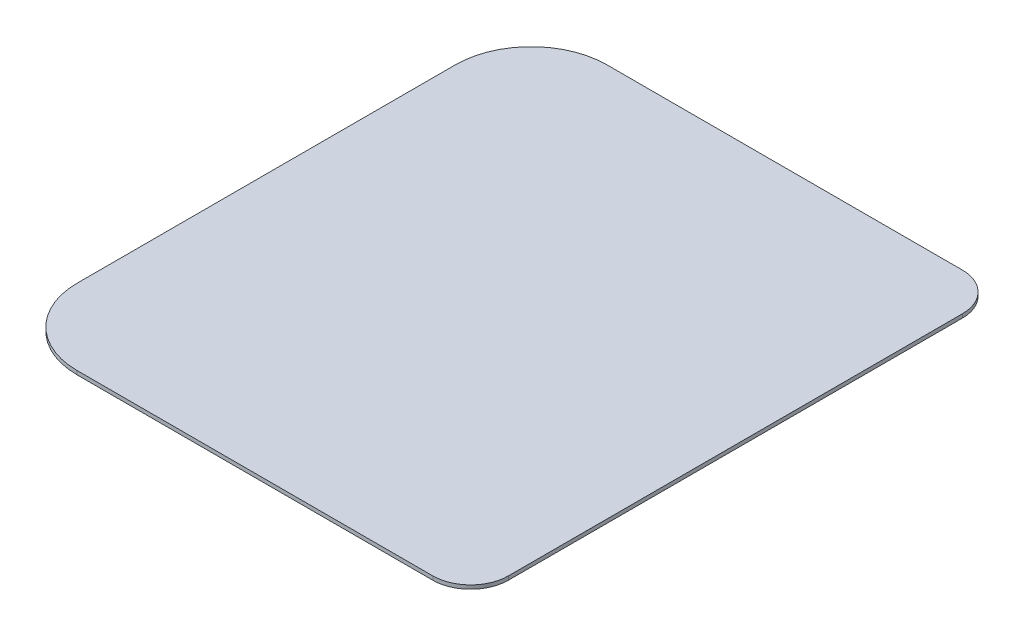
ISO-10303-21;
HEADER;
FILE_DESCRIPTION(('STEP AP214'),'2;1');
FILE_NAME('part.step','',(''),(''),'','','');
FILE_SCHEMA(('AUTOMOTIVE_DESIGN { 1 0 10303 214 1 1 1 1 }'));
ENDSEC;
DATA;
#1=APPLICATION_CONTEXT('core data for automotive mechanical design processes');
#2=APPLICATION_PROTOCOL_DEFINITION('international standard','automotive_design',2000,#1);
#3=PRODUCT_CONTEXT('',#1,'mechanical');
#4=PRODUCT('Part','Part','',(#3));
#5=PRODUCT_RELATED_PRODUCT_CATEGORY('part','',(#4));
#6=PRODUCT_DEFINITION_FORMATION('','',#4);
#7=PRODUCT_DEFINITION_CONTEXT('part definition',#1,'design');
#8=PRODUCT_DEFINITION('design','',#6,#7);
#9=PRODUCT_DEFINITION_SHAPE('','',#8);
#10=(LENGTH_UNIT() NAMED_UNIT(*) SI_UNIT(.MILLI.,.METRE.));
#11=(NAMED_UNIT(*) PLANE_ANGLE_UNIT() SI_UNIT($,.RADIAN.));
#12=(NAMED_UNIT(*) SI_UNIT($,.STERADIAN.) SOLID_ANGLE_UNIT());
#13=UNCERTAINTY_MEASURE_WITH_UNIT(LENGTH_MEASURE(1.E-05),#10,'distance_accuracy_value','');
#14=(GEOMETRIC_REPRESENTATION_CONTEXT(3) GLOBAL_UNCERTAINTY_ASSIGNED_CONTEXT((#13)) GLOBAL_UNIT_ASSIGNED_CONTEXT((#10,
#11,#12)) REPRESENTATION_CONTEXT('',''));
#15=CARTESIAN_POINT('',(0.,0.,0.));
#16=DIRECTION('',(0.,0.,1.));
#17=DIRECTION('',(1.,0.,0.));
#18=AXIS2_PLACEMENT_3D('',#15,#16,#17);
#19=CARTESIAN_POINT('',(-210.,5.,250.));
#20=DIRECTION('',(0.,-1.,0.));
#21=DIRECTION('',(0.,0.,-1.));
#22=AXIS2_PLACEMENT_3D('',#19,#20,#21);
#23=CYLINDRICAL_SURFACE('',#22,100.);
#24=CARTESIAN_POINT('',(-210.,0.,250.));
#25=DIRECTION('',(0.,1.,0.));
#26=DIRECTION('',(0.,0.,-1.));
#27=AXIS2_PLACEMENT_3D('',#24,#25,#26);
#28=CIRCLE('',#27,100.);
#29=CARTESIAN_POINT('',(-310.,0.,250.));
#30=VERTEX_POINT('',#29);
#31=CARTESIAN_POINT('',(-210.,0.,350.));
#32=VERTEX_POINT('',#31);
#33=EDGE_CURVE('E208',#30,#32,#28,.T.);
#34=ORIENTED_EDGE('',*,*,#33,.T.);
#35=DIRECTION('',(0.,-1.,0.));
#36=VECTOR('',#35,1.);
#37=CARTESIAN_POINT('',(-210.,5.,350.));
#38=LINE('',#37,#36);
#39=CARTESIAN_POINT('',(-210.,5.,350.));
#40=VERTEX_POINT('',#39);
#41=EDGE_CURVE('E12',#40,#32,#38,.T.);
#42=ORIENTED_EDGE('',*,*,#41,.F.);
#43=CARTESIAN_POINT('',(-210.,5.,250.));
#44=DIRECTION('',(0.,1.,0.));
#45=DIRECTION('',(0.,0.,-1.));
#46=AXIS2_PLACEMENT_3D('',#43,#44,#45);
#47=CIRCLE('',#46,100.);
#48=CARTESIAN_POINT('',(-310.,5.,250.));
#49=VERTEX_POINT('',#48);
#50=EDGE_CURVE('E162',#49,#40,#47,.T.);
#51=ORIENTED_EDGE('',*,*,#50,.F.);
#52=DIRECTION('',(0.,-1.,0.));
#53=VECTOR('',#52,1.);
#54=CARTESIAN_POINT('',(-310.,5.,250.));
#55=LINE('',#54,#53);
#56=EDGE_CURVE('E137',#49,#30,#55,.T.);
#57=ORIENTED_EDGE('',*,*,#56,.T.);
#58=EDGE_LOOP('',(#34,#42,#51,#57));
#59=FACE_BOUND('',#58,.T.);
#60=ADVANCED_FACE('F40',(#59),#23,.T.);
#61=CARTESIAN_POINT('',(-210.,5.,350.));
#62=DIRECTION('',(0.,0.,-1.));
#63=DIRECTION('',(-1.,0.,0.));
#64=AXIS2_PLACEMENT_3D('',#61,#62,#63);
#65=PLANE('',#64);
#66=DIRECTION('',(1.,0.,0.));
#67=VECTOR('',#66,1.);
#68=CARTESIAN_POINT('',(-210.,0.,350.));
#69=LINE('',#68,#67);
#70=CARTESIAN_POINT('',(260.,0.,350.));
#71=VERTEX_POINT('',#70);
#72=EDGE_CURVE('E199',#32,#71,#69,.T.);
#73=ORIENTED_EDGE('',*,*,#72,.T.);
#74=DIRECTION('',(0.,-1.,0.));
#75=VECTOR('',#74,1.);
#76=CARTESIAN_POINT('',(260.,5.,350.));
#77=LINE('',#76,#75);
#78=CARTESIAN_POINT('',(260.,5.,350.));
#79=VERTEX_POINT('',#78);
#80=EDGE_CURVE('E49',#79,#71,#77,.T.);
#81=ORIENTED_EDGE('',*,*,#80,.F.);
#82=DIRECTION('',(1.,0.,0.));
#83=VECTOR('',#82,1.);
#84=CARTESIAN_POINT('',(-210.,5.,350.));
#85=LINE('',#84,#83);
#86=EDGE_CURVE('E100',#40,#79,#85,.T.);
#87=ORIENTED_EDGE('',*,*,#86,.F.);
#88=ORIENTED_EDGE('',*,*,#41,.T.);
#89=EDGE_LOOP('',(#73,#81,#87,#88));
#90=FACE_BOUND('',#89,.T.);
#91=ADVANCED_FACE('F230',(#90),#65,.F.);
#92=CARTESIAN_POINT('',(260.,5.,300.));
#93=DIRECTION('',(0.,-1.,0.));
#94=DIRECTION('',(0.,0.,-1.));
#95=AXIS2_PLACEMENT_3D('',#92,#93,#94);
#96=CYLINDRICAL_SURFACE('',#95,50.);
#97=CARTESIAN_POINT('',(260.,0.,300.));
#98=DIRECTION('',(0.,1.,0.));
#99=DIRECTION('',(0.,0.,-1.));
#100=AXIS2_PLACEMENT_3D('',#97,#98,#99);
#101=CIRCLE('',#100,50.);
#102=CARTESIAN_POINT('',(310.,0.,300.));
#103=VERTEX_POINT('',#102);
#104=EDGE_CURVE('E194',#71,#103,#101,.T.);
#105=ORIENTED_EDGE('',*,*,#104,.T.);
#106=DIRECTION('',(0.,-1.,0.));
#107=VECTOR('',#106,1.);
#108=CARTESIAN_POINT('',(310.,5.,300.));
#109=LINE('',#108,#107);
#110=CARTESIAN_POINT('',(310.,5.,300.));
#111=VERTEX_POINT('',#110);
#112=EDGE_CURVE('E184',#111,#103,#109,.T.);
#113=ORIENTED_EDGE('',*,*,#112,.F.);
#114=CARTESIAN_POINT('',(260.,5.,300.));
#115=DIRECTION('',(0.,1.,0.));
#116=DIRECTION('',(0.,0.,-1.));
#117=AXIS2_PLACEMENT_3D('',#114,#115,#116);
#118=CIRCLE('',#117,50.);
#119=EDGE_CURVE('E154',#79,#111,#118,.T.);
#120=ORIENTED_EDGE('',*,*,#119,.F.);
#121=ORIENTED_EDGE('',*,*,#80,.T.);
#122=EDGE_LOOP('',(#105,#113,#120,#121));
#123=FACE_BOUND('',#122,.T.);
#124=ADVANCED_FACE('F192',(#123),#96,.T.);
#125=CARTESIAN_POINT('',(310.,5.,300.));
#126=DIRECTION('',(-1.,0.,0.));
#127=DIRECTION('',(0.,0.,1.));
#128=AXIS2_PLACEMENT_3D('',#125,#126,#127);
#129=PLANE('',#128);
#130=DIRECTION('',(0.,0.,-1.));
#131=VECTOR('',#130,1.);
#132=CARTESIAN_POINT('',(310.,0.,300.));
#133=LINE('',#132,#131);
#134=CARTESIAN_POINT('',(310.,0.,-300.));
#135=VERTEX_POINT('',#134);
#136=EDGE_CURVE('E201',#103,#135,#133,.T.);
#137=ORIENTED_EDGE('',*,*,#136,.T.);
#138=DIRECTION('',(0.,-1.,0.));
#139=VECTOR('',#138,1.);
#140=CARTESIAN_POINT('',(310.,5.,-300.));
#141=LINE('',#140,#139);
#142=CARTESIAN_POINT('',(310.,5.,-300.));
#143=VERTEX_POINT('',#142);
#144=EDGE_CURVE('E180',#143,#135,#141,.T.);
#145=ORIENTED_EDGE('',*,*,#144,.F.);
#146=DIRECTION('',(0.,0.,-1.));
#147=VECTOR('',#146,1.);
#148=CARTESIAN_POINT('',(310.,5.,300.));
#149=LINE('',#148,#147);
#150=EDGE_CURVE('E150',#111,#143,#149,.T.);
#151=ORIENTED_EDGE('',*,*,#150,.F.);
#152=ORIENTED_EDGE('',*,*,#112,.T.);
#153=EDGE_LOOP('',(#137,#145,#151,#152));
#154=FACE_BOUND('',#153,.T.);
#155=ADVANCED_FACE('F237',(#154),#129,.F.);
#156=CARTESIAN_POINT('',(260.,5.,-300.));
#157=DIRECTION('',(0.,-1.,0.));
#158=DIRECTION('',(0.,0.,-1.));
#159=AXIS2_PLACEMENT_3D('',#156,#157,#158);
#160=CYLINDRICAL_SURFACE('',#159,50.);
#161=CARTESIAN_POINT('',(260.,0.,-300.));
#162=DIRECTION('',(0.,1.,0.));
#163=DIRECTION('',(0.,0.,1.));
#164=AXIS2_PLACEMENT_3D('',#161,#162,#163);
#165=CIRCLE('',#164,50.);
#166=CARTESIAN_POINT('',(260.,0.,-350.));
#167=VERTEX_POINT('',#166);
#168=EDGE_CURVE('E206',#135,#167,#165,.T.);
#169=ORIENTED_EDGE('',*,*,#168,.T.);
#170=DIRECTION('',(0.,-1.,0.));
#171=VECTOR('',#170,1.);
#172=CARTESIAN_POINT('',(260.,5.,-350.));
#173=LINE('',#172,#171);
#174=CARTESIAN_POINT('',(260.,5.,-350.));
#175=VERTEX_POINT('',#174);
#176=EDGE_CURVE('E130',#175,#167,#173,.T.);
#177=ORIENTED_EDGE('',*,*,#176,.F.);
#178=CARTESIAN_POINT('',(260.,5.,-300.));
#179=DIRECTION('',(0.,1.,0.));
#180=DIRECTION('',(0.,0.,1.));
#181=AXIS2_PLACEMENT_3D('',#178,#179,#180);
#182=CIRCLE('',#181,50.);
#183=EDGE_CURVE('E119',#143,#175,#182,.T.);
#184=ORIENTED_EDGE('',*,*,#183,.F.);
#185=ORIENTED_EDGE('',*,*,#144,.T.);
#186=EDGE_LOOP('',(#169,#177,#184,#185));
#187=FACE_BOUND('',#186,.T.);
#188=ADVANCED_FACE('F214',(#187),#160,.T.);
#189=CARTESIAN_POINT('',(-210.,5.,-350.));
#190=DIRECTION('',(0.,0.,1.));
#191=DIRECTION('',(1.,0.,0.));
#192=AXIS2_PLACEMENT_3D('',#189,#190,#191);
#193=PLANE('',#192);
#194=DIRECTION('',(-1.,0.,0.));
#195=VECTOR('',#194,1.);
#196=CARTESIAN_POINT('',(-210.,0.,-350.));
#197=LINE('',#196,#195);
#198=CARTESIAN_POINT('',(-210.,0.,-350.));
#199=VERTEX_POINT('',#198);
#200=EDGE_CURVE('E128',#167,#199,#197,.T.);
#201=ORIENTED_EDGE('',*,*,#200,.T.);
#202=DIRECTION('',(0.,-1.,0.));
#203=VECTOR('',#202,1.);
#204=CARTESIAN_POINT('',(-210.,5.,-350.));
#205=LINE('',#204,#203);
#206=CARTESIAN_POINT('',(-210.,5.,-350.));
#207=VERTEX_POINT('',#206);
#208=EDGE_CURVE('E125',#207,#199,#205,.T.);
#209=ORIENTED_EDGE('',*,*,#208,.F.);
#210=DIRECTION('',(-1.,0.,0.));
#211=VECTOR('',#210,1.);
#212=CARTESIAN_POINT('',(-210.,5.,-350.));
#213=LINE('',#212,#211);
#214=EDGE_CURVE('E113',#175,#207,#213,.T.);
#215=ORIENTED_EDGE('',*,*,#214,.F.);
#216=ORIENTED_EDGE('',*,*,#176,.T.);
#217=EDGE_LOOP('',(#201,#209,#215,#216));
#218=FACE_BOUND('',#217,.T.);
#219=ADVANCED_FACE('F126',(#218),#193,.F.);
#220=CARTESIAN_POINT('',(-210.,5.,-250.));
#221=DIRECTION('',(0.,-1.,0.));
#222=DIRECTION('',(0.,0.,-1.));
#223=AXIS2_PLACEMENT_3D('',#220,#221,#222);
#224=CYLINDRICAL_SURFACE('',#223,100.);
#225=CARTESIAN_POINT('',(-210.,0.,-250.));
#226=DIRECTION('',(0.,1.,0.));
#227=DIRECTION('',(0.,0.,-1.));
#228=AXIS2_PLACEMENT_3D('',#225,#226,#227);
#229=CIRCLE('',#228,100.);
#230=CARTESIAN_POINT('',(-310.,0.,-250.));
#231=VERTEX_POINT('',#230);
#232=EDGE_CURVE('E86',#199,#231,#229,.T.);
#233=ORIENTED_EDGE('',*,*,#232,.T.);
#234=DIRECTION('',(0.,-1.,0.));
#235=VECTOR('',#234,1.);
#236=CARTESIAN_POINT('',(-310.,5.,-250.));
#237=LINE('',#236,#235);
#238=CARTESIAN_POINT('',(-310.,5.,-250.));
#239=VERTEX_POINT('',#238);
#240=EDGE_CURVE('E131',#239,#231,#237,.T.);
#241=ORIENTED_EDGE('',*,*,#240,.F.);
#242=CARTESIAN_POINT('',(-210.,5.,-250.));
#243=DIRECTION('',(0.,1.,0.));
#244=DIRECTION('',(0.,0.,-1.));
#245=AXIS2_PLACEMENT_3D('',#242,#243,#244);
#246=CIRCLE('',#245,100.);
#247=EDGE_CURVE('E117',#207,#239,#246,.T.);
#248=ORIENTED_EDGE('',*,*,#247,.F.);
#249=ORIENTED_EDGE('',*,*,#208,.T.);
#250=EDGE_LOOP('',(#233,#241,#248,#249));
#251=FACE_BOUND('',#250,.T.);
#252=ADVANCED_FACE('F133',(#251),#224,.T.);
#253=CARTESIAN_POINT('',(-310.,5.,250.));
#254=DIRECTION('',(1.,0.,0.));
#255=DIRECTION('',(0.,0.,-1.));
#256=AXIS2_PLACEMENT_3D('',#253,#254,#255);
#257=PLANE('',#256);
#258=DIRECTION('',(0.,0.,1.));
#259=VECTOR('',#258,1.);
#260=CARTESIAN_POINT('',(-310.,0.,250.));
#261=LINE('',#260,#259);
#262=EDGE_CURVE('E92',#231,#30,#261,.T.);
#263=ORIENTED_EDGE('',*,*,#262,.T.);
#264=ORIENTED_EDGE('',*,*,#56,.F.);
#265=DIRECTION('',(0.,0.,1.));
#266=VECTOR('',#265,1.);
#267=CARTESIAN_POINT('',(-310.,5.,250.));
#268=LINE('',#267,#266);
#269=EDGE_CURVE('E57',#239,#49,#268,.T.);
#270=ORIENTED_EDGE('',*,*,#269,.F.);
#271=ORIENTED_EDGE('',*,*,#240,.T.);
#272=EDGE_LOOP('',(#263,#264,#270,#271));
#273=FACE_BOUND('',#272,.T.);
#274=ADVANCED_FACE('F219',(#273),#257,.F.);
#275=CARTESIAN_POINT('',(-210.,5.,250.));
#276=DIRECTION('',(0.,-1.,0.));
#277=DIRECTION('',(0.,0.,-1.));
#278=AXIS2_PLACEMENT_3D('',#275,#276,#277);
#279=PLANE('',#278);
#280=ORIENTED_EDGE('',*,*,#50,.T.);
#281=ORIENTED_EDGE('',*,*,#86,.T.);
#282=ORIENTED_EDGE('',*,*,#119,.T.);
#283=ORIENTED_EDGE('',*,*,#150,.T.);
#284=ORIENTED_EDGE('',*,*,#183,.T.);
#285=ORIENTED_EDGE('',*,*,#214,.T.);
#286=ORIENTED_EDGE('',*,*,#247,.T.);
#287=ORIENTED_EDGE('',*,*,#269,.T.);
#288=EDGE_LOOP('',(#280,#281,#282,#283,#284,#285,#286,#287));
#289=FACE_BOUND('',#288,.T.);
#290=ADVANCED_FACE('F115',(#289),#279,.F.);
#291=CARTESIAN_POINT('',(-210.,0.,250.));
#292=DIRECTION('',(0.,-1.,0.));
#293=DIRECTION('',(0.,0.,-1.));
#294=AXIS2_PLACEMENT_3D('',#291,#292,#293);
#295=PLANE('',#294);
#296=ORIENTED_EDGE('',*,*,#33,.F.);
#297=ORIENTED_EDGE('',*,*,#262,.F.);
#298=ORIENTED_EDGE('',*,*,#232,.F.);
#299=ORIENTED_EDGE('',*,*,#200,.F.);
#300=ORIENTED_EDGE('',*,*,#168,.F.);
#301=ORIENTED_EDGE('',*,*,#136,.F.);
#302=ORIENTED_EDGE('',*,*,#104,.F.);
#303=ORIENTED_EDGE('',*,*,#72,.F.);
#304=EDGE_LOOP('',(#296,#297,#298,#299,#300,#301,#302,#303));
#305=FACE_BOUND('',#304,.T.);
#306=ADVANCED_FACE('F198',(#305),#295,.T.);
#307=CLOSED_SHELL('',(#60,#91,#124,#155,#188,#219,#252,#274,#290,#306));
#308=MANIFOLD_SOLID_BREP('B2',#307);
#309=ADVANCED_BREP_SHAPE_REPRESENTATION('',(#18,#308),#14);
#310=SHAPE_DEFINITION_REPRESENTATION(#9,#309);
ENDSEC;
END-ISO-10303-21;
